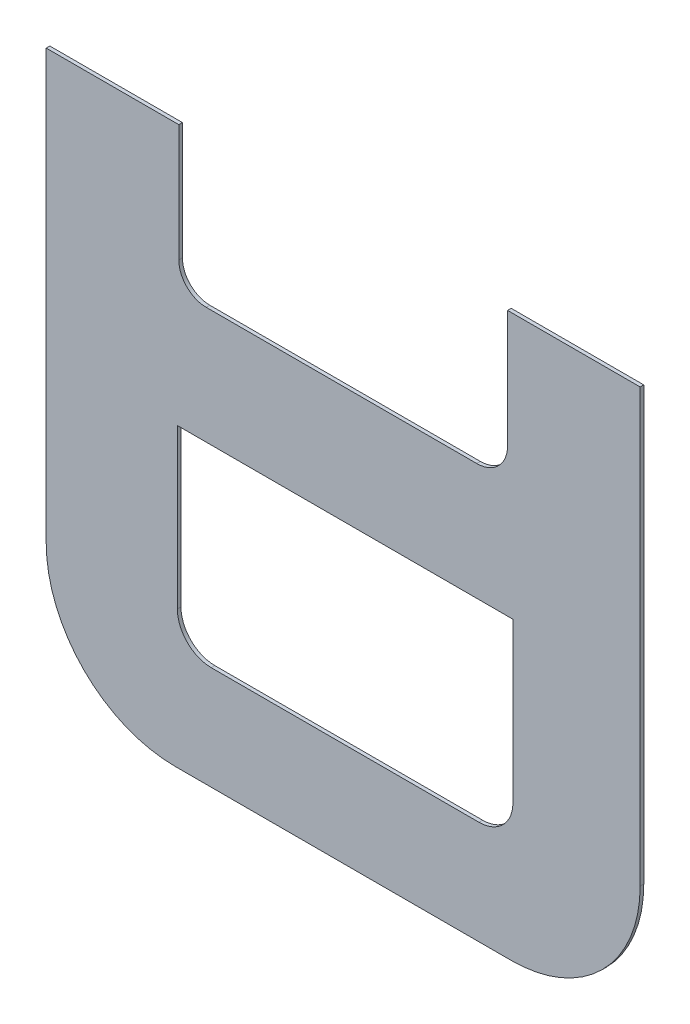
ISO-10303-21;
HEADER;
FILE_DESCRIPTION(('STEP AP214'),'2;1');
FILE_NAME('part.step','',(''),(''),'','','');
FILE_SCHEMA(('AUTOMOTIVE_DESIGN { 1 0 10303 214 1 1 1 1 }'));
ENDSEC;
DATA;
#1=APPLICATION_CONTEXT('core data for automotive mechanical design processes');
#2=APPLICATION_PROTOCOL_DEFINITION('international standard','automotive_design',2000,#1);
#3=PRODUCT_CONTEXT('',#1,'mechanical');
#4=PRODUCT('Part','Part','',(#3));
#5=PRODUCT_RELATED_PRODUCT_CATEGORY('part','',(#4));
#6=PRODUCT_DEFINITION_FORMATION('','',#4);
#7=PRODUCT_DEFINITION_CONTEXT('part definition',#1,'design');
#8=PRODUCT_DEFINITION('design','',#6,#7);
#9=PRODUCT_DEFINITION_SHAPE('','',#8);
#10=(LENGTH_UNIT() NAMED_UNIT(*) SI_UNIT(.MILLI.,.METRE.));
#11=(NAMED_UNIT(*) PLANE_ANGLE_UNIT() SI_UNIT($,.RADIAN.));
#12=(NAMED_UNIT(*) SI_UNIT($,.STERADIAN.) SOLID_ANGLE_UNIT());
#13=UNCERTAINTY_MEASURE_WITH_UNIT(LENGTH_MEASURE(1.E-05),#10,'distance_accuracy_value','');
#14=(GEOMETRIC_REPRESENTATION_CONTEXT(3) GLOBAL_UNCERTAINTY_ASSIGNED_CONTEXT((#13)) GLOBAL_UNIT_ASSIGNED_CONTEXT((#10,
#11,#12)) REPRESENTATION_CONTEXT('',''));
#15=CARTESIAN_POINT('',(0.,0.,0.));
#16=DIRECTION('',(0.,0.,1.));
#17=DIRECTION('',(1.,0.,0.));
#18=AXIS2_PLACEMENT_3D('',#15,#16,#17);
#19=CARTESIAN_POINT('',(0.151883414179,-14.61543242665,0.01));
#20=DIRECTION('',(0.,0.,1.));
#21=DIRECTION('',(1.,0.,0.));
#22=AXIS2_PLACEMENT_3D('',#19,#20,#21);
#23=PLANE('',#22);
#24=DIRECTION('',(0.,-1.,0.));
#25=VECTOR('',#24,1.);
#26=CARTESIAN_POINT('',(-0.309185936795,-14.541942,0.01));
#27=LINE('',#26,#25);
#28=CARTESIAN_POINT('',(-0.309185936795,-14.541942,0.01));
#29=VERTEX_POINT('',#28);
#30=CARTESIAN_POINT('',(-0.309185936795,-14.98122985714,0.01));
#31=VERTEX_POINT('',#30);
#32=EDGE_CURVE('E345',#29,#31,#27,.T.);
#33=ORIENTED_EDGE('',*,*,#32,.F.);
#34=DIRECTION('',(-1.,0.,0.));
#35=VECTOR('',#34,1.);
#36=CARTESIAN_POINT('',(0.618447586089,-14.541942,0.01));
#37=LINE('',#36,#35);
#38=CARTESIAN_POINT('',(0.618447586089,-14.541942,0.01));
#39=VERTEX_POINT('',#38);
#40=EDGE_CURVE('E20',#39,#29,#37,.T.);
#41=ORIENTED_EDGE('',*,*,#40,.F.);
#42=DIRECTION('',(0.,1.,0.));
#43=VECTOR('',#42,1.);
#44=CARTESIAN_POINT('',(0.618447586089,-14.98122985714,0.01));
#45=LINE('',#44,#43);
#46=CARTESIAN_POINT('',(0.618447586089,-14.98122985714,0.01));
#47=VERTEX_POINT('',#46);
#48=EDGE_CURVE('E383',#47,#39,#45,.T.);
#49=ORIENTED_EDGE('',*,*,#48,.F.);
#50=CARTESIAN_POINT('',(0.524770435009,-14.98122985714,0.01));
#51=DIRECTION('',(0.,0.,1.));
#52=DIRECTION('',(1.,0.,0.));
#53=AXIS2_PLACEMENT_3D('',#50,#51,#52);
#54=CIRCLE('',#53,0.09367715108027);
#55=CARTESIAN_POINT('',(0.524770435009,-15.07490700822,0.01));
#56=VERTEX_POINT('',#55);
#57=EDGE_CURVE('E335',#56,#47,#54,.T.);
#58=ORIENTED_EDGE('',*,*,#57,.F.);
#59=DIRECTION('',(1.,0.,0.));
#60=VECTOR('',#59,1.);
#61=CARTESIAN_POINT('',(-0.215508785714,-15.07490700822,0.01));
#62=LINE('',#61,#60);
#63=CARTESIAN_POINT('',(-0.215508785714,-15.07490700822,0.01));
#64=VERTEX_POINT('',#63);
#65=EDGE_CURVE('E368',#64,#56,#62,.T.);
#66=ORIENTED_EDGE('',*,*,#65,.F.);
#67=CARTESIAN_POINT('',(-0.215508785714,-14.98122985714,0.01));
#68=DIRECTION('',(0.,0.,1.));
#69=DIRECTION('',(1.,0.,0.));
#70=AXIS2_PLACEMENT_3D('',#67,#68,#69);
#71=CIRCLE('',#70,0.09367715108027);
#72=EDGE_CURVE('E357',#31,#64,#71,.T.);
#73=ORIENTED_EDGE('',*,*,#72,.F.);
#74=EDGE_LOOP('',(#33,#41,#49,#58,#66,#73));
#75=FACE_BOUND('',#74,.T.);
#76=DIRECTION('',(0.,1.,0.));
#77=VECTOR('',#76,1.);
#78=CARTESIAN_POINT('',(-0.305249086073,-14.143511941,0.01));
#79=LINE('',#78,#77);
#80=CARTESIAN_POINT('',(-0.305249086073,-14.143511941,0.01));
#81=VERTEX_POINT('',#80);
#82=CARTESIAN_POINT('',(-0.305249086073,-13.81964530464,0.01));
#83=VERTEX_POINT('',#82);
#84=EDGE_CURVE('E209',#81,#83,#79,.T.);
#85=ORIENTED_EDGE('',*,*,#84,.T.);
#86=DIRECTION('',(-1.,0.,0.));
#87=VECTOR('',#86,1.);
#88=CARTESIAN_POINT('',(-0.305249086073,-13.81964530464,0.01));
#89=LINE('',#88,#87);
#90=CARTESIAN_POINT('',(-0.671717151838,-13.81964530464,0.01));
#91=VERTEX_POINT('',#90);
#92=EDGE_CURVE('E229',#83,#91,#89,.T.);
#93=ORIENTED_EDGE('',*,*,#92,.T.);
#94=DIRECTION('',(0.,-1.,0.));
#95=VECTOR('',#94,1.);
#96=CARTESIAN_POINT('',(-0.671717151838,-13.81964530464,0.01));
#97=LINE('',#96,#95);
#98=CARTESIAN_POINT('',(-0.671717151838,-15.00496,0.01));
#99=VERTEX_POINT('',#98);
#100=EDGE_CURVE('E249',#91,#99,#97,.T.);
#101=ORIENTED_EDGE('',*,*,#100,.T.);
#102=CARTESIAN_POINT('',(-0.315502535783,-15.00496,0.01));
#103=DIRECTION('',(0.,0.,1.));
#104=DIRECTION('',(1.,0.,0.));
#105=AXIS2_PLACEMENT_3D('',#102,#103,#104);
#106=CIRCLE('',#105,0.356214616055);
#107=CARTESIAN_POINT('',(-0.315502535783,-15.36117461605,0.01));
#108=VERTEX_POINT('',#107);
#109=EDGE_CURVE('E219',#99,#108,#106,.T.);
#110=ORIENTED_EDGE('',*,*,#109,.T.);
#111=DIRECTION('',(1.,0.,0.));
#112=VECTOR('',#111,1.);
#113=CARTESIAN_POINT('',(-0.315502535783,-15.36117461605,0.01));
#114=LINE('',#113,#112);
#115=CARTESIAN_POINT('',(0.613952,-15.36117461605,0.01));
#116=VERTEX_POINT('',#115);
#117=EDGE_CURVE('E270',#108,#116,#114,.T.);
#118=ORIENTED_EDGE('',*,*,#117,.T.);
#119=CARTESIAN_POINT('',(0.613952,-15.00496,0.01));
#120=DIRECTION('',(0.,0.,1.));
#121=DIRECTION('',(1.,0.,0.));
#122=AXIS2_PLACEMENT_3D('',#119,#120,#121);
#123=CIRCLE('',#122,0.356214616055);
#124=CARTESIAN_POINT('',(0.970166616055,-15.00496,0.01));
#125=VERTEX_POINT('',#124);
#126=EDGE_CURVE('E285',#116,#125,#123,.T.);
#127=ORIENTED_EDGE('',*,*,#126,.T.);
#128=DIRECTION('',(0.,1.,0.));
#129=VECTOR('',#128,1.);
#130=CARTESIAN_POINT('',(0.970166616055,-15.00496,0.01));
#131=LINE('',#130,#129);
#132=CARTESIAN_POINT('',(0.970166616055,-13.80994105899,0.01));
#133=VERTEX_POINT('',#132);
#134=EDGE_CURVE('E301',#125,#133,#131,.T.);
#135=ORIENTED_EDGE('',*,*,#134,.T.);
#136=DIRECTION('',(-1.,0.,0.));
#137=VECTOR('',#136,1.);
#138=CARTESIAN_POINT('',(0.970166616055,-13.80994105899,0.01));
#139=LINE('',#138,#137);
#140=CARTESIAN_POINT('',(0.60369855029,-13.80994105899,0.01));
#141=VERTEX_POINT('',#140);
#142=EDGE_CURVE('E237',#133,#141,#139,.T.);
#143=ORIENTED_EDGE('',*,*,#142,.T.);
#144=DIRECTION('',(0.,-1.,0.));
#145=VECTOR('',#144,1.);
#146=CARTESIAN_POINT('',(0.60369855029,-13.80994105899,0.01));
#147=LINE('',#146,#145);
#148=CARTESIAN_POINT('',(0.60369855029,-14.13380769535,0.01));
#149=VERTEX_POINT('',#148);
#150=EDGE_CURVE('E311',#141,#149,#147,.T.);
#151=ORIENTED_EDGE('',*,*,#150,.T.);
#152=CARTESIAN_POINT('',(0.518407609284,-14.13380769535,0.01));
#153=DIRECTION('',(0.,0.,1.));
#154=DIRECTION('',(1.,0.,0.));
#155=AXIS2_PLACEMENT_3D('',#152,#153,#154);
#156=CIRCLE('',#155,0.08529094100588);
#157=CARTESIAN_POINT('',(0.518407609284,-14.21909863636,0.01));
#158=VERTEX_POINT('',#157);
#159=EDGE_CURVE('E323',#158,#149,#156,.T.);
#160=ORIENTED_EDGE('',*,*,#159,.F.);
#161=DIRECTION('',(-1.,0.,0.));
#162=VECTOR('',#161,1.);
#163=CARTESIAN_POINT('',(0.518407609284,-14.21909863636,0.01));
#164=LINE('',#163,#162);
#165=CARTESIAN_POINT('',(-0.229662390716,-14.21909863636,0.01));
#166=VERTEX_POINT('',#165);
#167=EDGE_CURVE('E286',#158,#166,#164,.T.);
#168=ORIENTED_EDGE('',*,*,#167,.T.);
#169=CARTESIAN_POINT('',(-0.229662390716,-14.143511941,0.01));
#170=DIRECTION('',(0.,0.,1.));
#171=DIRECTION('',(1.,0.,0.));
#172=AXIS2_PLACEMENT_3D('',#169,#170,#171);
#173=CIRCLE('',#172,0.07558669535776);
#174=EDGE_CURVE('E193',#81,#166,#173,.T.);
#175=ORIENTED_EDGE('',*,*,#174,.F.);
#176=EDGE_LOOP('',(#85,#93,#101,#110,#118,#127,#135,#143,#151,#160,#168,#175));
#177=FACE_BOUND('',#176,.T.);
#178=ADVANCED_FACE('F17',(#75,#177),#23,.T.);
#179=CARTESIAN_POINT('',(0.151883414179,-14.61543242665,0.));
#180=DIRECTION('',(0.,0.,1.));
#181=DIRECTION('',(1.,0.,0.));
#182=AXIS2_PLACEMENT_3D('',#179,#180,#181);
#183=PLANE('',#182);
#184=DIRECTION('',(0.,-1.,0.));
#185=VECTOR('',#184,1.);
#186=CARTESIAN_POINT('',(-0.309185936795,-14.541942,0.));
#187=LINE('',#186,#185);
#188=CARTESIAN_POINT('',(-0.309185936795,-14.541942,0.));
#189=VERTEX_POINT('',#188);
#190=CARTESIAN_POINT('',(-0.309185936795,-14.98122985714,0.));
#191=VERTEX_POINT('',#190);
#192=EDGE_CURVE('E353',#189,#191,#187,.T.);
#193=ORIENTED_EDGE('',*,*,#192,.T.);
#194=CARTESIAN_POINT('',(-0.215508785714,-14.98122985714,0.));
#195=DIRECTION('',(0.,0.,1.));
#196=DIRECTION('',(1.,0.,0.));
#197=AXIS2_PLACEMENT_3D('',#194,#195,#196);
#198=CIRCLE('',#197,0.09367715108027);
#199=CARTESIAN_POINT('',(-0.215508785714,-15.07490700822,0.));
#200=VERTEX_POINT('',#199);
#201=EDGE_CURVE('E365',#191,#200,#198,.T.);
#202=ORIENTED_EDGE('',*,*,#201,.T.);
#203=DIRECTION('',(1.,0.,0.));
#204=VECTOR('',#203,1.);
#205=CARTESIAN_POINT('',(-0.215508785714,-15.07490700822,0.));
#206=LINE('',#205,#204);
#207=CARTESIAN_POINT('',(0.524770435009,-15.07490700822,0.));
#208=VERTEX_POINT('',#207);
#209=EDGE_CURVE('E377',#200,#208,#206,.T.);
#210=ORIENTED_EDGE('',*,*,#209,.T.);
#211=CARTESIAN_POINT('',(0.524770435009,-14.98122985714,0.));
#212=DIRECTION('',(0.,0.,1.));
#213=DIRECTION('',(1.,0.,0.));
#214=AXIS2_PLACEMENT_3D('',#211,#212,#213);
#215=CIRCLE('',#214,0.09367715108027);
#216=CARTESIAN_POINT('',(0.618447586089,-14.98122985714,0.));
#217=VERTEX_POINT('',#216);
#218=EDGE_CURVE('E334',#208,#217,#215,.T.);
#219=ORIENTED_EDGE('',*,*,#218,.T.);
#220=DIRECTION('',(0.,1.,0.));
#221=VECTOR('',#220,1.);
#222=CARTESIAN_POINT('',(0.618447586089,-14.98122985714,0.));
#223=LINE('',#222,#221);
#224=CARTESIAN_POINT('',(0.618447586089,-14.541942,0.));
#225=VERTEX_POINT('',#224);
#226=EDGE_CURVE('E312',#217,#225,#223,.T.);
#227=ORIENTED_EDGE('',*,*,#226,.T.);
#228=DIRECTION('',(-1.,0.,0.));
#229=VECTOR('',#228,1.);
#230=CARTESIAN_POINT('',(0.618447586089,-14.541942,0.));
#231=LINE('',#230,#229);
#232=EDGE_CURVE('E11',#225,#189,#231,.T.);
#233=ORIENTED_EDGE('',*,*,#232,.T.);
#234=EDGE_LOOP('',(#193,#202,#210,#219,#227,#233));
#235=FACE_BOUND('',#234,.T.);
#236=DIRECTION('',(0.,1.,0.));
#237=VECTOR('',#236,1.);
#238=CARTESIAN_POINT('',(-0.305249086073,-14.143511941,0.));
#239=LINE('',#238,#237);
#240=CARTESIAN_POINT('',(-0.305249086073,-14.143511941,0.));
#241=VERTEX_POINT('',#240);
#242=CARTESIAN_POINT('',(-0.305249086073,-13.81964530464,0.));
#243=VERTEX_POINT('',#242);
#244=EDGE_CURVE('E196',#241,#243,#239,.T.);
#245=ORIENTED_EDGE('',*,*,#244,.F.);
#246=CARTESIAN_POINT('',(-0.229662390716,-14.143511941,0.));
#247=DIRECTION('',(0.,0.,1.));
#248=DIRECTION('',(1.,0.,0.));
#249=AXIS2_PLACEMENT_3D('',#246,#247,#248);
#250=CIRCLE('',#249,0.07558669535776);
#251=CARTESIAN_POINT('',(-0.229662390716,-14.21909863636,0.));
#252=VERTEX_POINT('',#251);
#253=EDGE_CURVE('E182',#241,#252,#250,.T.);
#254=ORIENTED_EDGE('',*,*,#253,.T.);
#255=DIRECTION('',(-1.,0.,0.));
#256=VECTOR('',#255,1.);
#257=CARTESIAN_POINT('',(0.518407609284,-14.21909863636,0.));
#258=LINE('',#257,#256);
#259=CARTESIAN_POINT('',(0.518407609284,-14.21909863636,0.));
#260=VERTEX_POINT('',#259);
#261=EDGE_CURVE('E329',#260,#252,#258,.T.);
#262=ORIENTED_EDGE('',*,*,#261,.F.);
#263=CARTESIAN_POINT('',(0.518407609284,-14.13380769535,0.));
#264=DIRECTION('',(0.,0.,1.));
#265=DIRECTION('',(1.,0.,0.));
#266=AXIS2_PLACEMENT_3D('',#263,#264,#265);
#267=CIRCLE('',#266,0.08529094100588);
#268=CARTESIAN_POINT('',(0.60369855029,-14.13380769535,0.));
#269=VERTEX_POINT('',#268);
#270=EDGE_CURVE('E326',#260,#269,#267,.T.);
#271=ORIENTED_EDGE('',*,*,#270,.T.);
#272=DIRECTION('',(0.,-1.,0.));
#273=VECTOR('',#272,1.);
#274=CARTESIAN_POINT('',(0.60369855029,-13.80994105899,0.));
#275=LINE('',#274,#273);
#276=CARTESIAN_POINT('',(0.60369855029,-13.80994105899,0.));
#277=VERTEX_POINT('',#276);
#278=EDGE_CURVE('E232',#277,#269,#275,.T.);
#279=ORIENTED_EDGE('',*,*,#278,.F.);
#280=DIRECTION('',(-1.,0.,0.));
#281=VECTOR('',#280,1.);
#282=CARTESIAN_POINT('',(0.970166616055,-13.80994105899,0.));
#283=LINE('',#282,#281);
#284=CARTESIAN_POINT('',(0.970166616055,-13.80994105899,0.));
#285=VERTEX_POINT('',#284);
#286=EDGE_CURVE('E242',#285,#277,#283,.T.);
#287=ORIENTED_EDGE('',*,*,#286,.F.);
#288=DIRECTION('',(0.,1.,0.));
#289=VECTOR('',#288,1.);
#290=CARTESIAN_POINT('',(0.970166616055,-15.00496,0.));
#291=LINE('',#290,#289);
#292=CARTESIAN_POINT('',(0.970166616055,-15.00496,0.));
#293=VERTEX_POINT('',#292);
#294=EDGE_CURVE('E293',#293,#285,#291,.T.);
#295=ORIENTED_EDGE('',*,*,#294,.F.);
#296=CARTESIAN_POINT('',(0.613952,-15.00496,0.));
#297=DIRECTION('',(0.,0.,1.));
#298=DIRECTION('',(1.,0.,0.));
#299=AXIS2_PLACEMENT_3D('',#296,#297,#298);
#300=CIRCLE('',#299,0.356214616055);
#301=CARTESIAN_POINT('',(0.613952,-15.36117461605,0.));
#302=VERTEX_POINT('',#301);
#303=EDGE_CURVE('E277',#302,#293,#300,.T.);
#304=ORIENTED_EDGE('',*,*,#303,.F.);
#305=DIRECTION('',(1.,0.,0.));
#306=VECTOR('',#305,1.);
#307=CARTESIAN_POINT('',(-0.315502535783,-15.36117461605,0.));
#308=LINE('',#307,#306);
#309=CARTESIAN_POINT('',(-0.315502535783,-15.36117461605,0.));
#310=VERTEX_POINT('',#309);
#311=EDGE_CURVE('E215',#310,#302,#308,.T.);
#312=ORIENTED_EDGE('',*,*,#311,.F.);
#313=CARTESIAN_POINT('',(-0.315502535783,-15.00496,0.));
#314=DIRECTION('',(0.,0.,1.));
#315=DIRECTION('',(1.,0.,0.));
#316=AXIS2_PLACEMENT_3D('',#313,#314,#315);
#317=CIRCLE('',#316,0.356214616055);
#318=CARTESIAN_POINT('',(-0.671717151838,-15.00496,0.));
#319=VERTEX_POINT('',#318);
#320=EDGE_CURVE('E253',#319,#310,#317,.T.);
#321=ORIENTED_EDGE('',*,*,#320,.F.);
#322=DIRECTION('',(0.,-1.,0.));
#323=VECTOR('',#322,1.);
#324=CARTESIAN_POINT('',(-0.671717151838,-13.81964530464,0.));
#325=LINE('',#324,#323);
#326=CARTESIAN_POINT('',(-0.671717151838,-13.81964530464,0.));
#327=VERTEX_POINT('',#326);
#328=EDGE_CURVE('E224',#327,#319,#325,.T.);
#329=ORIENTED_EDGE('',*,*,#328,.F.);
#330=DIRECTION('',(-1.,0.,0.));
#331=VECTOR('',#330,1.);
#332=CARTESIAN_POINT('',(-0.305249086073,-13.81964530464,0.));
#333=LINE('',#332,#331);
#334=EDGE_CURVE('E199',#243,#327,#333,.T.);
#335=ORIENTED_EDGE('',*,*,#334,.F.);
#336=EDGE_LOOP('',(#245,#254,#262,#271,#279,#287,#295,#304,#312,#321,#329,#335));
#337=FACE_BOUND('',#336,.T.);
#338=ADVANCED_FACE('F197',(#235,#337),#183,.F.);
#339=CARTESIAN_POINT('',(0.618447586089,-14.541942,0.));
#340=DIRECTION('',(0.,-1.,0.));
#341=DIRECTION('',(0.,0.,-1.));
#342=AXIS2_PLACEMENT_3D('',#339,#340,#341);
#343=PLANE('',#342);
#344=DIRECTION('',(0.,0.,1.));
#345=VECTOR('',#344,1.);
#346=CARTESIAN_POINT('',(0.618447586089,-14.541942,0.));
#347=LINE('',#346,#345);
#348=EDGE_CURVE('E315',#225,#39,#347,.T.);
#349=ORIENTED_EDGE('',*,*,#348,.T.);
#350=ORIENTED_EDGE('',*,*,#40,.T.);
#351=DIRECTION('',(0.,0.,1.));
#352=VECTOR('',#351,1.);
#353=CARTESIAN_POINT('',(-0.309185936795,-14.541942,0.));
#354=LINE('',#353,#352);
#355=EDGE_CURVE('E192',#189,#29,#354,.T.);
#356=ORIENTED_EDGE('',*,*,#355,.F.);
#357=ORIENTED_EDGE('',*,*,#232,.F.);
#358=EDGE_LOOP('',(#349,#350,#356,#357));
#359=FACE_BOUND('',#358,.T.);
#360=ADVANCED_FACE('F410',(#359),#343,.T.);
#361=CARTESIAN_POINT('',(0.618447586089,-14.98122985714,0.));
#362=DIRECTION('',(-1.,0.,0.));
#363=DIRECTION('',(0.,0.,1.));
#364=AXIS2_PLACEMENT_3D('',#361,#362,#363);
#365=PLANE('',#364);
#366=DIRECTION('',(0.,0.,1.));
#367=VECTOR('',#366,1.);
#368=CARTESIAN_POINT('',(0.618447586089,-14.98122985714,0.));
#369=LINE('',#368,#367);
#370=EDGE_CURVE('E330',#217,#47,#369,.T.);
#371=ORIENTED_EDGE('',*,*,#370,.T.);
#372=ORIENTED_EDGE('',*,*,#48,.T.);
#373=ORIENTED_EDGE('',*,*,#348,.F.);
#374=ORIENTED_EDGE('',*,*,#226,.F.);
#375=EDGE_LOOP('',(#371,#372,#373,#374));
#376=FACE_BOUND('',#375,.T.);
#377=ADVANCED_FACE('F395',(#376),#365,.T.);
#378=CARTESIAN_POINT('',(0.524770435009,-14.98122985714,0.));
#379=DIRECTION('',(0.,0.,-1.));
#380=DIRECTION('',(1.,0.,0.));
#381=AXIS2_PLACEMENT_3D('',#378,#379,#380);
#382=CYLINDRICAL_SURFACE('',#381,0.09367715108027);
#383=DIRECTION('',(0.,0.,1.));
#384=VECTOR('',#383,1.);
#385=CARTESIAN_POINT('',(0.524770435009,-15.07490700822,0.));
#386=LINE('',#385,#384);
#387=EDGE_CURVE('E373',#208,#56,#386,.T.);
#388=ORIENTED_EDGE('',*,*,#387,.T.);
#389=ORIENTED_EDGE('',*,*,#57,.T.);
#390=ORIENTED_EDGE('',*,*,#370,.F.);
#391=ORIENTED_EDGE('',*,*,#218,.F.);
#392=EDGE_LOOP('',(#388,#389,#390,#391));
#393=FACE_BOUND('',#392,.T.);
#394=ADVANCED_FACE('F400',(#393),#382,.F.);
#395=CARTESIAN_POINT('',(-0.215508785714,-15.07490700822,0.));
#396=DIRECTION('',(0.,1.,0.));
#397=DIRECTION('',(1.,0.,0.));
#398=AXIS2_PLACEMENT_3D('',#395,#396,#397);
#399=PLANE('',#398);
#400=DIRECTION('',(0.,0.,1.));
#401=VECTOR('',#400,1.);
#402=CARTESIAN_POINT('',(-0.215508785714,-15.07490700822,0.));
#403=LINE('',#402,#401);
#404=EDGE_CURVE('E361',#200,#64,#403,.T.);
#405=ORIENTED_EDGE('',*,*,#404,.T.);
#406=ORIENTED_EDGE('',*,*,#65,.T.);
#407=ORIENTED_EDGE('',*,*,#387,.F.);
#408=ORIENTED_EDGE('',*,*,#209,.F.);
#409=EDGE_LOOP('',(#405,#406,#407,#408));
#410=FACE_BOUND('',#409,.T.);
#411=ADVANCED_FACE('F402',(#410),#399,.T.);
#412=CARTESIAN_POINT('',(-0.215508785714,-14.98122985714,0.));
#413=DIRECTION('',(0.,0.,-1.));
#414=DIRECTION('',(1.,0.,0.));
#415=AXIS2_PLACEMENT_3D('',#412,#413,#414);
#416=CYLINDRICAL_SURFACE('',#415,0.09367715108027);
#417=DIRECTION('',(0.,0.,1.));
#418=VECTOR('',#417,1.);
#419=CARTESIAN_POINT('',(-0.309185936795,-14.98122985714,0.));
#420=LINE('',#419,#418);
#421=EDGE_CURVE('E349',#191,#31,#420,.T.);
#422=ORIENTED_EDGE('',*,*,#421,.T.);
#423=ORIENTED_EDGE('',*,*,#72,.T.);
#424=ORIENTED_EDGE('',*,*,#404,.F.);
#425=ORIENTED_EDGE('',*,*,#201,.F.);
#426=EDGE_LOOP('',(#422,#423,#424,#425));
#427=FACE_BOUND('',#426,.T.);
#428=ADVANCED_FACE('F405',(#427),#416,.F.);
#429=CARTESIAN_POINT('',(-0.309185936795,-14.541942,0.));
#430=DIRECTION('',(1.,0.,0.));
#431=DIRECTION('',(0.,1.,0.));
#432=AXIS2_PLACEMENT_3D('',#429,#430,#431);
#433=PLANE('',#432);
#434=ORIENTED_EDGE('',*,*,#355,.T.);
#435=ORIENTED_EDGE('',*,*,#32,.T.);
#436=ORIENTED_EDGE('',*,*,#421,.F.);
#437=ORIENTED_EDGE('',*,*,#192,.F.);
#438=EDGE_LOOP('',(#434,#435,#436,#437));
#439=FACE_BOUND('',#438,.T.);
#440=ADVANCED_FACE('F409',(#439),#433,.T.);
#441=CARTESIAN_POINT('',(-0.229662390716,-14.143511941,0.));
#442=DIRECTION('',(0.,0.,-1.));
#443=DIRECTION('',(1.,0.,0.));
#444=AXIS2_PLACEMENT_3D('',#441,#442,#443);
#445=CYLINDRICAL_SURFACE('',#444,0.07558669535776);
#446=DIRECTION('',(0.,0.,1.));
#447=VECTOR('',#446,1.);
#448=CARTESIAN_POINT('',(-0.305249086073,-14.143511941,0.));
#449=LINE('',#448,#447);
#450=EDGE_CURVE('E186',#241,#81,#449,.T.);
#451=ORIENTED_EDGE('',*,*,#450,.T.);
#452=ORIENTED_EDGE('',*,*,#174,.T.);
#453=DIRECTION('',(0.,0.,1.));
#454=VECTOR('',#453,1.);
#455=CARTESIAN_POINT('',(-0.229662390716,-14.21909863636,0.));
#456=LINE('',#455,#454);
#457=EDGE_CURVE('E188',#252,#166,#456,.T.);
#458=ORIENTED_EDGE('',*,*,#457,.F.);
#459=ORIENTED_EDGE('',*,*,#253,.F.);
#460=EDGE_LOOP('',(#451,#452,#458,#459));
#461=FACE_BOUND('',#460,.T.);
#462=ADVANCED_FACE('F184',(#461),#445,.F.);
#463=CARTESIAN_POINT('',(0.518407609284,-14.21909863636,0.));
#464=DIRECTION('',(0.,-1.,0.));
#465=DIRECTION('',(0.,0.,-1.));
#466=AXIS2_PLACEMENT_3D('',#463,#464,#465);
#467=PLANE('',#466);
#468=DIRECTION('',(0.,0.,1.));
#469=VECTOR('',#468,1.);
#470=CARTESIAN_POINT('',(0.518407609284,-14.21909863636,0.));
#471=LINE('',#470,#469);
#472=EDGE_CURVE('E319',#260,#158,#471,.T.);
#473=ORIENTED_EDGE('',*,*,#472,.F.);
#474=ORIENTED_EDGE('',*,*,#261,.T.);
#475=ORIENTED_EDGE('',*,*,#457,.T.);
#476=ORIENTED_EDGE('',*,*,#167,.F.);
#477=EDGE_LOOP('',(#473,#474,#475,#476));
#478=FACE_BOUND('',#477,.T.);
#479=ADVANCED_FACE('F509',(#478),#467,.F.);
#480=CARTESIAN_POINT('',(0.518407609284,-14.13380769535,0.));
#481=DIRECTION('',(0.,0.,-1.));
#482=DIRECTION('',(1.,0.,0.));
#483=AXIS2_PLACEMENT_3D('',#480,#481,#482);
#484=CYLINDRICAL_SURFACE('',#483,0.08529094100588);
#485=ORIENTED_EDGE('',*,*,#472,.T.);
#486=ORIENTED_EDGE('',*,*,#159,.T.);
#487=DIRECTION('',(0.,0.,1.));
#488=VECTOR('',#487,1.);
#489=CARTESIAN_POINT('',(0.60369855029,-14.13380769535,0.));
#490=LINE('',#489,#488);
#491=EDGE_CURVE('E236',#269,#149,#490,.T.);
#492=ORIENTED_EDGE('',*,*,#491,.F.);
#493=ORIENTED_EDGE('',*,*,#270,.F.);
#494=EDGE_LOOP('',(#485,#486,#492,#493));
#495=FACE_BOUND('',#494,.T.);
#496=ADVANCED_FACE('F434',(#495),#484,.F.);
#497=CARTESIAN_POINT('',(0.60369855029,-13.80994105899,0.));
#498=DIRECTION('',(1.,0.,0.));
#499=DIRECTION('',(0.,1.,0.));
#500=AXIS2_PLACEMENT_3D('',#497,#498,#499);
#501=PLANE('',#500);
#502=DIRECTION('',(0.,0.,1.));
#503=VECTOR('',#502,1.);
#504=CARTESIAN_POINT('',(0.60369855029,-13.80994105899,0.));
#505=LINE('',#504,#503);
#506=EDGE_CURVE('E238',#277,#141,#505,.T.);
#507=ORIENTED_EDGE('',*,*,#506,.F.);
#508=ORIENTED_EDGE('',*,*,#278,.T.);
#509=ORIENTED_EDGE('',*,*,#491,.T.);
#510=ORIENTED_EDGE('',*,*,#150,.F.);
#511=EDGE_LOOP('',(#507,#508,#509,#510));
#512=FACE_BOUND('',#511,.T.);
#513=ADVANCED_FACE('F428',(#512),#501,.F.);
#514=CARTESIAN_POINT('',(0.970166616055,-13.80994105899,0.));
#515=DIRECTION('',(0.,-1.,0.));
#516=DIRECTION('',(0.,0.,-1.));
#517=AXIS2_PLACEMENT_3D('',#514,#515,#516);
#518=PLANE('',#517);
#519=DIRECTION('',(0.,0.,1.));
#520=VECTOR('',#519,1.);
#521=CARTESIAN_POINT('',(0.970166616055,-13.80994105899,0.));
#522=LINE('',#521,#520);
#523=EDGE_CURVE('E297',#285,#133,#522,.T.);
#524=ORIENTED_EDGE('',*,*,#523,.F.);
#525=ORIENTED_EDGE('',*,*,#286,.T.);
#526=ORIENTED_EDGE('',*,*,#506,.T.);
#527=ORIENTED_EDGE('',*,*,#142,.F.);
#528=EDGE_LOOP('',(#524,#525,#526,#527));
#529=FACE_BOUND('',#528,.T.);
#530=ADVANCED_FACE('F433',(#529),#518,.F.);
#531=CARTESIAN_POINT('',(0.970166616055,-15.00496,0.));
#532=DIRECTION('',(-1.,0.,0.));
#533=DIRECTION('',(0.,0.,1.));
#534=AXIS2_PLACEMENT_3D('',#531,#532,#533);
#535=PLANE('',#534);
#536=DIRECTION('',(0.,0.,1.));
#537=VECTOR('',#536,1.);
#538=CARTESIAN_POINT('',(0.970166616055,-15.00496,0.));
#539=LINE('',#538,#537);
#540=EDGE_CURVE('E281',#293,#125,#539,.T.);
#541=ORIENTED_EDGE('',*,*,#540,.F.);
#542=ORIENTED_EDGE('',*,*,#294,.T.);
#543=ORIENTED_EDGE('',*,*,#523,.T.);
#544=ORIENTED_EDGE('',*,*,#134,.F.);
#545=EDGE_LOOP('',(#541,#542,#543,#544));
#546=FACE_BOUND('',#545,.T.);
#547=ADVANCED_FACE('F477',(#546),#535,.F.);
#548=CARTESIAN_POINT('',(0.613952,-15.00496,0.));
#549=DIRECTION('',(0.,0.,-1.));
#550=DIRECTION('',(1.,0.,0.));
#551=AXIS2_PLACEMENT_3D('',#548,#549,#550);
#552=CYLINDRICAL_SURFACE('',#551,0.356214616055);
#553=DIRECTION('',(0.,0.,1.));
#554=VECTOR('',#553,1.);
#555=CARTESIAN_POINT('',(0.613952,-15.36117461605,0.));
#556=LINE('',#555,#554);
#557=EDGE_CURVE('E266',#302,#116,#556,.T.);
#558=ORIENTED_EDGE('',*,*,#557,.F.);
#559=ORIENTED_EDGE('',*,*,#303,.T.);
#560=ORIENTED_EDGE('',*,*,#540,.T.);
#561=ORIENTED_EDGE('',*,*,#126,.F.);
#562=EDGE_LOOP('',(#558,#559,#560,#561));
#563=FACE_BOUND('',#562,.T.);
#564=ADVANCED_FACE('F468',(#563),#552,.T.);
#565=CARTESIAN_POINT('',(-0.315502535783,-15.36117461605,0.));
#566=DIRECTION('',(0.,1.,0.));
#567=DIRECTION('',(1.,0.,0.));
#568=AXIS2_PLACEMENT_3D('',#565,#566,#567);
#569=PLANE('',#568);
#570=DIRECTION('',(0.,0.,1.));
#571=VECTOR('',#570,1.);
#572=CARTESIAN_POINT('',(-0.315502535783,-15.36117461605,0.));
#573=LINE('',#572,#571);
#574=EDGE_CURVE('E223',#310,#108,#573,.T.);
#575=ORIENTED_EDGE('',*,*,#574,.F.);
#576=ORIENTED_EDGE('',*,*,#311,.T.);
#577=ORIENTED_EDGE('',*,*,#557,.T.);
#578=ORIENTED_EDGE('',*,*,#117,.F.);
#579=EDGE_LOOP('',(#575,#576,#577,#578));
#580=FACE_BOUND('',#579,.T.);
#581=ADVANCED_FACE('F452',(#580),#569,.F.);
#582=CARTESIAN_POINT('',(-0.315502535783,-15.00496,0.));
#583=DIRECTION('',(0.,0.,-1.));
#584=DIRECTION('',(1.,0.,0.));
#585=AXIS2_PLACEMENT_3D('',#582,#583,#584);
#586=CYLINDRICAL_SURFACE('',#585,0.356214616055);
#587=DIRECTION('',(0.,0.,1.));
#588=VECTOR('',#587,1.);
#589=CARTESIAN_POINT('',(-0.671717151838,-15.00496,0.));
#590=LINE('',#589,#588);
#591=EDGE_CURVE('E228',#319,#99,#590,.T.);
#592=ORIENTED_EDGE('',*,*,#591,.F.);
#593=ORIENTED_EDGE('',*,*,#320,.T.);
#594=ORIENTED_EDGE('',*,*,#574,.T.);
#595=ORIENTED_EDGE('',*,*,#109,.F.);
#596=EDGE_LOOP('',(#592,#593,#594,#595));
#597=FACE_BOUND('',#596,.T.);
#598=ADVANCED_FACE('F447',(#597),#586,.T.);
#599=CARTESIAN_POINT('',(-0.671717151838,-13.81964530464,0.));
#600=DIRECTION('',(1.,0.,0.));
#601=DIRECTION('',(0.,1.,0.));
#602=AXIS2_PLACEMENT_3D('',#599,#600,#601);
#603=PLANE('',#602);
#604=DIRECTION('',(0.,0.,1.));
#605=VECTOR('',#604,1.);
#606=CARTESIAN_POINT('',(-0.671717151838,-13.81964530464,0.));
#607=LINE('',#606,#605);
#608=EDGE_CURVE('E245',#327,#91,#607,.T.);
#609=ORIENTED_EDGE('',*,*,#608,.F.);
#610=ORIENTED_EDGE('',*,*,#328,.T.);
#611=ORIENTED_EDGE('',*,*,#591,.T.);
#612=ORIENTED_EDGE('',*,*,#100,.F.);
#613=EDGE_LOOP('',(#609,#610,#611,#612));
#614=FACE_BOUND('',#613,.T.);
#615=ADVANCED_FACE('F420',(#614),#603,.F.);
#616=CARTESIAN_POINT('',(-0.305249086073,-13.81964530464,0.));
#617=DIRECTION('',(0.,-1.,0.));
#618=DIRECTION('',(0.,0.,-1.));
#619=AXIS2_PLACEMENT_3D('',#616,#617,#618);
#620=PLANE('',#619);
#621=DIRECTION('',(0.,0.,1.));
#622=VECTOR('',#621,1.);
#623=CARTESIAN_POINT('',(-0.305249086073,-13.81964530464,0.));
#624=LINE('',#623,#622);
#625=EDGE_CURVE('E204',#243,#83,#624,.T.);
#626=ORIENTED_EDGE('',*,*,#625,.F.);
#627=ORIENTED_EDGE('',*,*,#334,.T.);
#628=ORIENTED_EDGE('',*,*,#608,.T.);
#629=ORIENTED_EDGE('',*,*,#92,.F.);
#630=EDGE_LOOP('',(#626,#627,#628,#629));
#631=FACE_BOUND('',#630,.T.);
#632=ADVANCED_FACE('F415',(#631),#620,.F.);
#633=CARTESIAN_POINT('',(-0.305249086073,-14.143511941,0.));
#634=DIRECTION('',(-1.,0.,0.));
#635=DIRECTION('',(0.,0.,1.));
#636=AXIS2_PLACEMENT_3D('',#633,#634,#635);
#637=PLANE('',#636);
#638=ORIENTED_EDGE('',*,*,#450,.F.);
#639=ORIENTED_EDGE('',*,*,#244,.T.);
#640=ORIENTED_EDGE('',*,*,#625,.T.);
#641=ORIENTED_EDGE('',*,*,#84,.F.);
#642=EDGE_LOOP('',(#638,#639,#640,#641));
#643=FACE_BOUND('',#642,.T.);
#644=ADVANCED_FACE('F207',(#643),#637,.F.);
#645=CLOSED_SHELL('',(#178,#338,#360,#377,#394,#411,#428,#440,#462,#479,#496,#513,#530,#547,
#564,#581,#598,#615,#632,#644));
#646=MANIFOLD_SOLID_BREP('B1',#645);
#647=ADVANCED_BREP_SHAPE_REPRESENTATION('',(#18,#646),#14);
#648=SHAPE_DEFINITION_REPRESENTATION(#9,#647);
ENDSEC;
END-ISO-10303-21;
